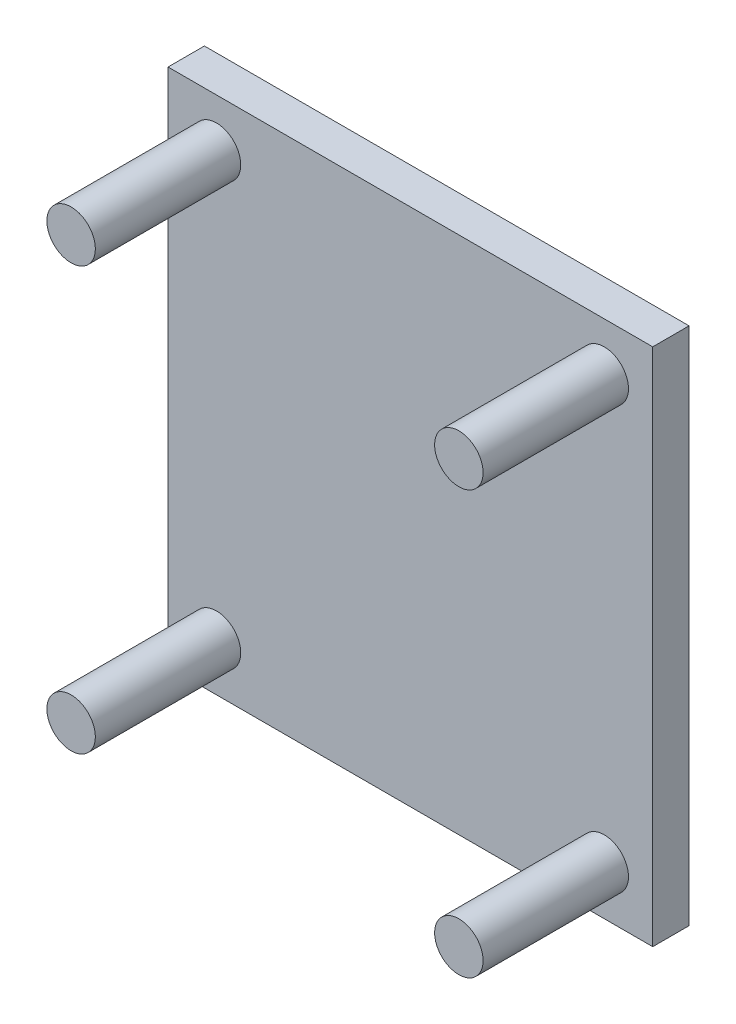
ISO-10303-21;
HEADER;
FILE_DESCRIPTION(('STEP AP214'),'2;1');
FILE_NAME('part.step','',(''),(''),'','','');
FILE_SCHEMA(('AUTOMOTIVE_DESIGN { 1 0 10303 214 1 1 1 1 }'));
ENDSEC;
DATA;
#1=APPLICATION_CONTEXT('core data for automotive mechanical design processes');
#2=APPLICATION_PROTOCOL_DEFINITION('international standard','automotive_design',2000,#1);
#3=PRODUCT_CONTEXT('',#1,'mechanical');
#4=PRODUCT('Part','Part','',(#3));
#5=PRODUCT_RELATED_PRODUCT_CATEGORY('part','',(#4));
#6=PRODUCT_DEFINITION_FORMATION('','',#4);
#7=PRODUCT_DEFINITION_CONTEXT('part definition',#1,'design');
#8=PRODUCT_DEFINITION('design','',#6,#7);
#9=PRODUCT_DEFINITION_SHAPE('','',#8);
#10=(LENGTH_UNIT() NAMED_UNIT(*) SI_UNIT(.MILLI.,.METRE.));
#11=(NAMED_UNIT(*) PLANE_ANGLE_UNIT() SI_UNIT($,.RADIAN.));
#12=(NAMED_UNIT(*) SI_UNIT($,.STERADIAN.) SOLID_ANGLE_UNIT());
#13=UNCERTAINTY_MEASURE_WITH_UNIT(LENGTH_MEASURE(1.E-05),#10,'distance_accuracy_value','');
#14=(GEOMETRIC_REPRESENTATION_CONTEXT(3) GLOBAL_UNCERTAINTY_ASSIGNED_CONTEXT((#13)) GLOBAL_UNIT_ASSIGNED_CONTEXT((#10,
#11,#12)) REPRESENTATION_CONTEXT('',''));
#15=CARTESIAN_POINT('',(0.,0.,0.));
#16=DIRECTION('',(0.,0.,1.));
#17=DIRECTION('',(1.,0.,0.));
#18=AXIS2_PLACEMENT_3D('',#15,#16,#17);
#19=CARTESIAN_POINT('',(-20.,21.4380909926965,3.));
#20=DIRECTION('',(1.,0.,0.));
#21=DIRECTION('',(0.,0.,-1.));
#22=AXIS2_PLACEMENT_3D('',#19,#20,#21);
#23=PLANE('',#22);
#24=DIRECTION('',(0.,-1.,0.));
#25=VECTOR('',#24,1.);
#26=CARTESIAN_POINT('',(-20.,21.4380909926965,0.));
#27=LINE('',#26,#25);
#28=CARTESIAN_POINT('',(-20.,21.4380909926965,0.));
#29=VERTEX_POINT('',#28);
#30=CARTESIAN_POINT('',(-20.,-21.4380909926965,0.));
#31=VERTEX_POINT('',#30);
#32=EDGE_CURVE('E100',#29,#31,#27,.T.);
#33=ORIENTED_EDGE('',*,*,#32,.T.);
#34=DIRECTION('',(0.,0.,-1.));
#35=VECTOR('',#34,1.);
#36=CARTESIAN_POINT('',(-20.,-21.4380909926965,3.));
#37=LINE('',#36,#35);
#38=CARTESIAN_POINT('',(-20.,-21.4380909926965,3.));
#39=VERTEX_POINT('',#38);
#40=EDGE_CURVE('E11',#39,#31,#37,.T.);
#41=ORIENTED_EDGE('',*,*,#40,.F.);
#42=DIRECTION('',(0.,-1.,0.));
#43=VECTOR('',#42,1.);
#44=CARTESIAN_POINT('',(-20.,21.4380909926965,3.));
#45=LINE('',#44,#43);
#46=CARTESIAN_POINT('',(-20.,21.4380909926965,3.));
#47=VERTEX_POINT('',#46);
#48=EDGE_CURVE('E88',#47,#39,#45,.T.);
#49=ORIENTED_EDGE('',*,*,#48,.F.);
#50=DIRECTION('',(0.,0.,-1.));
#51=VECTOR('',#50,1.);
#52=CARTESIAN_POINT('',(-20.,21.4380909926965,3.));
#53=LINE('',#52,#51);
#54=EDGE_CURVE('E96',#47,#29,#53,.T.);
#55=ORIENTED_EDGE('',*,*,#54,.T.);
#56=EDGE_LOOP('',(#33,#41,#49,#55));
#57=FACE_BOUND('',#56,.T.);
#58=ADVANCED_FACE('F37',(#57),#23,.F.);
#59=CARTESIAN_POINT('',(-20.,-21.4380909926965,3.));
#60=DIRECTION('',(0.,1.,0.));
#61=DIRECTION('',(0.,0.,1.));
#62=AXIS2_PLACEMENT_3D('',#59,#60,#61);
#63=PLANE('',#62);
#64=DIRECTION('',(1.,0.,0.));
#65=VECTOR('',#64,1.);
#66=CARTESIAN_POINT('',(-20.,-21.4380909926965,0.));
#67=LINE('',#66,#65);
#68=CARTESIAN_POINT('',(20.,-21.4380909926965,0.));
#69=VERTEX_POINT('',#68);
#70=EDGE_CURVE('E92',#31,#69,#67,.T.);
#71=ORIENTED_EDGE('',*,*,#70,.T.);
#72=DIRECTION('',(0.,0.,-1.));
#73=VECTOR('',#72,1.);
#74=CARTESIAN_POINT('',(20.,-21.4380909926965,3.));
#75=LINE('',#74,#73);
#76=CARTESIAN_POINT('',(20.,-21.4380909926965,3.));
#77=VERTEX_POINT('',#76);
#78=EDGE_CURVE('E45',#77,#69,#75,.T.);
#79=ORIENTED_EDGE('',*,*,#78,.F.);
#80=DIRECTION('',(1.,0.,0.));
#81=VECTOR('',#80,1.);
#82=CARTESIAN_POINT('',(-20.,-21.4380909926965,3.));
#83=LINE('',#82,#81);
#84=EDGE_CURVE('E83',#39,#77,#83,.T.);
#85=ORIENTED_EDGE('',*,*,#84,.F.);
#86=ORIENTED_EDGE('',*,*,#40,.T.);
#87=EDGE_LOOP('',(#71,#79,#85,#86));
#88=FACE_BOUND('',#87,.T.);
#89=ADVANCED_FACE('F91',(#88),#63,.F.);
#90=CARTESIAN_POINT('',(20.,-21.4380909926965,3.));
#91=DIRECTION('',(-1.,0.,0.));
#92=DIRECTION('',(0.,0.,1.));
#93=AXIS2_PLACEMENT_3D('',#90,#91,#92);
#94=PLANE('',#93);
#95=DIRECTION('',(0.,1.,0.));
#96=VECTOR('',#95,1.);
#97=CARTESIAN_POINT('',(20.,-21.4380909926965,0.));
#98=LINE('',#97,#96);
#99=CARTESIAN_POINT('',(20.,21.4380909926965,0.));
#100=VERTEX_POINT('',#99);
#101=EDGE_CURVE('E70',#69,#100,#98,.T.);
#102=ORIENTED_EDGE('',*,*,#101,.T.);
#103=DIRECTION('',(0.,0.,-1.));
#104=VECTOR('',#103,1.);
#105=CARTESIAN_POINT('',(20.,21.4380909926965,3.));
#106=LINE('',#105,#104);
#107=CARTESIAN_POINT('',(20.,21.4380909926965,3.));
#108=VERTEX_POINT('',#107);
#109=EDGE_CURVE('E93',#108,#100,#106,.T.);
#110=ORIENTED_EDGE('',*,*,#109,.F.);
#111=DIRECTION('',(0.,1.,0.));
#112=VECTOR('',#111,1.);
#113=CARTESIAN_POINT('',(20.,-21.4380909926965,3.));
#114=LINE('',#113,#112);
#115=EDGE_CURVE('E86',#77,#108,#114,.T.);
#116=ORIENTED_EDGE('',*,*,#115,.F.);
#117=ORIENTED_EDGE('',*,*,#78,.T.);
#118=EDGE_LOOP('',(#102,#110,#116,#117));
#119=FACE_BOUND('',#118,.T.);
#120=ADVANCED_FACE('F94',(#119),#94,.F.);
#121=CARTESIAN_POINT('',(20.,21.4380909926965,3.));
#122=DIRECTION('',(0.,-1.,0.));
#123=DIRECTION('',(0.,0.,-1.));
#124=AXIS2_PLACEMENT_3D('',#121,#122,#123);
#125=PLANE('',#124);
#126=DIRECTION('',(-1.,0.,0.));
#127=VECTOR('',#126,1.);
#128=CARTESIAN_POINT('',(20.,21.4380909926965,0.));
#129=LINE('',#128,#127);
#130=EDGE_CURVE('E76',#100,#29,#129,.T.);
#131=ORIENTED_EDGE('',*,*,#130,.T.);
#132=ORIENTED_EDGE('',*,*,#54,.F.);
#133=DIRECTION('',(-1.,0.,0.));
#134=VECTOR('',#133,1.);
#135=CARTESIAN_POINT('',(20.,21.4380909926965,3.));
#136=LINE('',#135,#134);
#137=EDGE_CURVE('E53',#108,#47,#136,.T.);
#138=ORIENTED_EDGE('',*,*,#137,.F.);
#139=ORIENTED_EDGE('',*,*,#109,.T.);
#140=EDGE_LOOP('',(#131,#132,#138,#139));
#141=FACE_BOUND('',#140,.T.);
#142=ADVANCED_FACE('F108',(#141),#125,.F.);
#143=CARTESIAN_POINT('',(0.,0.,3.));
#144=DIRECTION('',(0.,0.,1.));
#145=DIRECTION('',(1.,0.,0.));
#146=AXIS2_PLACEMENT_3D('',#143,#144,#145);
#147=PLANE('',#146);
#148=CARTESIAN_POINT('',(16.,17.4380909926965,3.));
#149=DIRECTION('',(0.,0.,1.));
#150=DIRECTION('',(1.,0.,0.));
#151=AXIS2_PLACEMENT_3D('',#148,#149,#150);
#152=CIRCLE('',#151,2.);
#153=CARTESIAN_POINT('',(18.,17.4380909926965,3.));
#154=VERTEX_POINT('',#153);
#155=EDGE_CURVE('E132',#154,#154,#152,.T.);
#156=ORIENTED_EDGE('',*,*,#155,.F.);
#157=EDGE_LOOP('',(#156));
#158=FACE_BOUND('',#157,.T.);
#159=CARTESIAN_POINT('',(16.,-17.4380909926965,3.));
#160=DIRECTION('',(0.,0.,1.));
#161=DIRECTION('',(1.,0.,0.));
#162=AXIS2_PLACEMENT_3D('',#159,#160,#161);
#163=CIRCLE('',#162,2.);
#164=CARTESIAN_POINT('',(18.,-17.4380909926965,3.));
#165=VERTEX_POINT('',#164);
#166=EDGE_CURVE('E126',#165,#165,#163,.T.);
#167=ORIENTED_EDGE('',*,*,#166,.F.);
#168=EDGE_LOOP('',(#167));
#169=FACE_BOUND('',#168,.T.);
#170=CARTESIAN_POINT('',(-16.,17.4380909926965,3.));
#171=DIRECTION('',(0.,0.,1.));
#172=DIRECTION('',(1.,0.,0.));
#173=AXIS2_PLACEMENT_3D('',#170,#171,#172);
#174=CIRCLE('',#173,2.);
#175=CARTESIAN_POINT('',(-14.,17.4380909926965,3.));
#176=VERTEX_POINT('',#175);
#177=EDGE_CURVE('E120',#176,#176,#174,.T.);
#178=ORIENTED_EDGE('',*,*,#177,.F.);
#179=EDGE_LOOP('',(#178));
#180=FACE_BOUND('',#179,.T.);
#181=CARTESIAN_POINT('',(-16.,-17.4380909926965,3.));
#182=DIRECTION('',(0.,0.,1.));
#183=DIRECTION('',(1.,0.,0.));
#184=AXIS2_PLACEMENT_3D('',#181,#182,#183);
#185=CIRCLE('',#184,2.);
#186=CARTESIAN_POINT('',(-14.,-17.4380909926965,3.));
#187=VERTEX_POINT('',#186);
#188=EDGE_CURVE('E114',#187,#187,#185,.T.);
#189=ORIENTED_EDGE('',*,*,#188,.F.);
#190=EDGE_LOOP('',(#189));
#191=FACE_BOUND('',#190,.T.);
#192=ORIENTED_EDGE('',*,*,#48,.T.);
#193=ORIENTED_EDGE('',*,*,#84,.T.);
#194=ORIENTED_EDGE('',*,*,#115,.T.);
#195=ORIENTED_EDGE('',*,*,#137,.T.);
#196=EDGE_LOOP('',(#192,#193,#194,#195));
#197=FACE_BOUND('',#196,.T.);
#198=ADVANCED_FACE('F84',(#158,#169,#180,#191,#197),#147,.T.);
#199=CARTESIAN_POINT('',(0.,0.,0.));
#200=DIRECTION('',(0.,0.,1.));
#201=DIRECTION('',(1.,0.,0.));
#202=AXIS2_PLACEMENT_3D('',#199,#200,#201);
#203=PLANE('',#202);
#204=ORIENTED_EDGE('',*,*,#32,.F.);
#205=ORIENTED_EDGE('',*,*,#130,.F.);
#206=ORIENTED_EDGE('',*,*,#101,.F.);
#207=ORIENTED_EDGE('',*,*,#70,.F.);
#208=EDGE_LOOP('',(#204,#205,#206,#207));
#209=FACE_BOUND('',#208,.T.);
#210=ADVANCED_FACE('F111',(#209),#203,.F.);
#211=CARTESIAN_POINT('',(-16.,-17.4380909926965,15.));
#212=DIRECTION('',(0.,0.,-1.));
#213=DIRECTION('',(-1.,0.,0.));
#214=AXIS2_PLACEMENT_3D('',#211,#212,#213);
#215=CYLINDRICAL_SURFACE('',#214,2.);
#216=CARTESIAN_POINT('',(-16.,-17.4380909926965,15.));
#217=DIRECTION('',(0.,0.,1.));
#218=DIRECTION('',(1.,0.,0.));
#219=AXIS2_PLACEMENT_3D('',#216,#217,#218);
#220=CIRCLE('',#219,2.);
#221=CARTESIAN_POINT('',(-14.,-17.4380909926965,15.));
#222=VERTEX_POINT('',#221);
#223=EDGE_CURVE('E103',#222,#222,#220,.T.);
#224=ORIENTED_EDGE('',*,*,#223,.F.);
#225=EDGE_LOOP('',(#224));
#226=FACE_BOUND('',#225,.T.);
#227=ORIENTED_EDGE('',*,*,#188,.T.);
#228=EDGE_LOOP('',(#227));
#229=FACE_BOUND('',#228,.T.);
#230=ADVANCED_FACE('F156',(#226,#229),#215,.T.);
#231=CARTESIAN_POINT('',(-16.,-17.4380909926965,15.));
#232=DIRECTION('',(0.,0.,1.));
#233=DIRECTION('',(1.,0.,0.));
#234=AXIS2_PLACEMENT_3D('',#231,#232,#233);
#235=PLANE('',#234);
#236=ORIENTED_EDGE('',*,*,#223,.T.);
#237=EDGE_LOOP('',(#236));
#238=FACE_BOUND('',#237,.T.);
#239=ADVANCED_FACE('F158',(#238),#235,.T.);
#240=CARTESIAN_POINT('',(-16.,17.4380909926965,15.));
#241=DIRECTION('',(0.,0.,-1.));
#242=DIRECTION('',(-1.,0.,0.));
#243=AXIS2_PLACEMENT_3D('',#240,#241,#242);
#244=CYLINDRICAL_SURFACE('',#243,2.);
#245=CARTESIAN_POINT('',(-16.,17.4380909926965,15.));
#246=DIRECTION('',(0.,0.,1.));
#247=DIRECTION('',(1.,0.,0.));
#248=AXIS2_PLACEMENT_3D('',#245,#246,#247);
#249=CIRCLE('',#248,2.);
#250=CARTESIAN_POINT('',(-14.,17.4380909926965,15.));
#251=VERTEX_POINT('',#250);
#252=EDGE_CURVE('E117',#251,#251,#249,.T.);
#253=ORIENTED_EDGE('',*,*,#252,.F.);
#254=EDGE_LOOP('',(#253));
#255=FACE_BOUND('',#254,.T.);
#256=ORIENTED_EDGE('',*,*,#177,.T.);
#257=EDGE_LOOP('',(#256));
#258=FACE_BOUND('',#257,.T.);
#259=ADVANCED_FACE('F165',(#255,#258),#244,.T.);
#260=CARTESIAN_POINT('',(-16.,17.4380909926965,15.));
#261=DIRECTION('',(0.,0.,1.));
#262=DIRECTION('',(1.,0.,0.));
#263=AXIS2_PLACEMENT_3D('',#260,#261,#262);
#264=PLANE('',#263);
#265=ORIENTED_EDGE('',*,*,#252,.T.);
#266=EDGE_LOOP('',(#265));
#267=FACE_BOUND('',#266,.T.);
#268=ADVANCED_FACE('F213',(#267),#264,.T.);
#269=CARTESIAN_POINT('',(16.,-17.4380909926965,15.));
#270=DIRECTION('',(0.,0.,-1.));
#271=DIRECTION('',(-1.,0.,0.));
#272=AXIS2_PLACEMENT_3D('',#269,#270,#271);
#273=CYLINDRICAL_SURFACE('',#272,2.);
#274=CARTESIAN_POINT('',(16.,-17.4380909926965,15.));
#275=DIRECTION('',(0.,0.,1.));
#276=DIRECTION('',(1.,0.,0.));
#277=AXIS2_PLACEMENT_3D('',#274,#275,#276);
#278=CIRCLE('',#277,2.);
#279=CARTESIAN_POINT('',(18.,-17.4380909926965,15.));
#280=VERTEX_POINT('',#279);
#281=EDGE_CURVE('E123',#280,#280,#278,.T.);
#282=ORIENTED_EDGE('',*,*,#281,.F.);
#283=EDGE_LOOP('',(#282));
#284=FACE_BOUND('',#283,.T.);
#285=ORIENTED_EDGE('',*,*,#166,.T.);
#286=EDGE_LOOP('',(#285));
#287=FACE_BOUND('',#286,.T.);
#288=ADVANCED_FACE('F222',(#284,#287),#273,.T.);
#289=CARTESIAN_POINT('',(16.,-17.4380909926965,15.));
#290=DIRECTION('',(0.,0.,1.));
#291=DIRECTION('',(1.,0.,0.));
#292=AXIS2_PLACEMENT_3D('',#289,#290,#291);
#293=PLANE('',#292);
#294=ORIENTED_EDGE('',*,*,#281,.T.);
#295=EDGE_LOOP('',(#294));
#296=FACE_BOUND('',#295,.T.);
#297=ADVANCED_FACE('F143',(#296),#293,.T.);
#298=CARTESIAN_POINT('',(16.,17.4380909926965,15.));
#299=DIRECTION('',(0.,0.,-1.));
#300=DIRECTION('',(-1.,0.,0.));
#301=AXIS2_PLACEMENT_3D('',#298,#299,#300);
#302=CYLINDRICAL_SURFACE('',#301,2.);
#303=CARTESIAN_POINT('',(16.,17.4380909926965,15.));
#304=DIRECTION('',(0.,0.,1.));
#305=DIRECTION('',(1.,0.,0.));
#306=AXIS2_PLACEMENT_3D('',#303,#304,#305);
#307=CIRCLE('',#306,2.);
#308=CARTESIAN_POINT('',(18.,17.4380909926965,15.));
#309=VERTEX_POINT('',#308);
#310=EDGE_CURVE('E129',#309,#309,#307,.T.);
#311=ORIENTED_EDGE('',*,*,#310,.F.);
#312=EDGE_LOOP('',(#311));
#313=FACE_BOUND('',#312,.T.);
#314=ORIENTED_EDGE('',*,*,#155,.T.);
#315=EDGE_LOOP('',(#314));
#316=FACE_BOUND('',#315,.T.);
#317=ADVANCED_FACE('F140',(#313,#316),#302,.T.);
#318=CARTESIAN_POINT('',(16.,17.4380909926965,15.));
#319=DIRECTION('',(0.,0.,1.));
#320=DIRECTION('',(1.,0.,0.));
#321=AXIS2_PLACEMENT_3D('',#318,#319,#320);
#322=PLANE('',#321);
#323=ORIENTED_EDGE('',*,*,#310,.T.);
#324=EDGE_LOOP('',(#323));
#325=FACE_BOUND('',#324,.T.);
#326=ADVANCED_FACE('F138',(#325),#322,.T.);
#327=CLOSED_SHELL('',(#58,#89,#120,#142,#198,#210,#230,#239,#259,#268,#288,#297,#317,#326));
#328=MANIFOLD_SOLID_BREP('B2',#327);
#329=ADVANCED_BREP_SHAPE_REPRESENTATION('',(#18,#328),#14);
#330=SHAPE_DEFINITION_REPRESENTATION(#9,#329);
ENDSEC;
END-ISO-10303-21;
